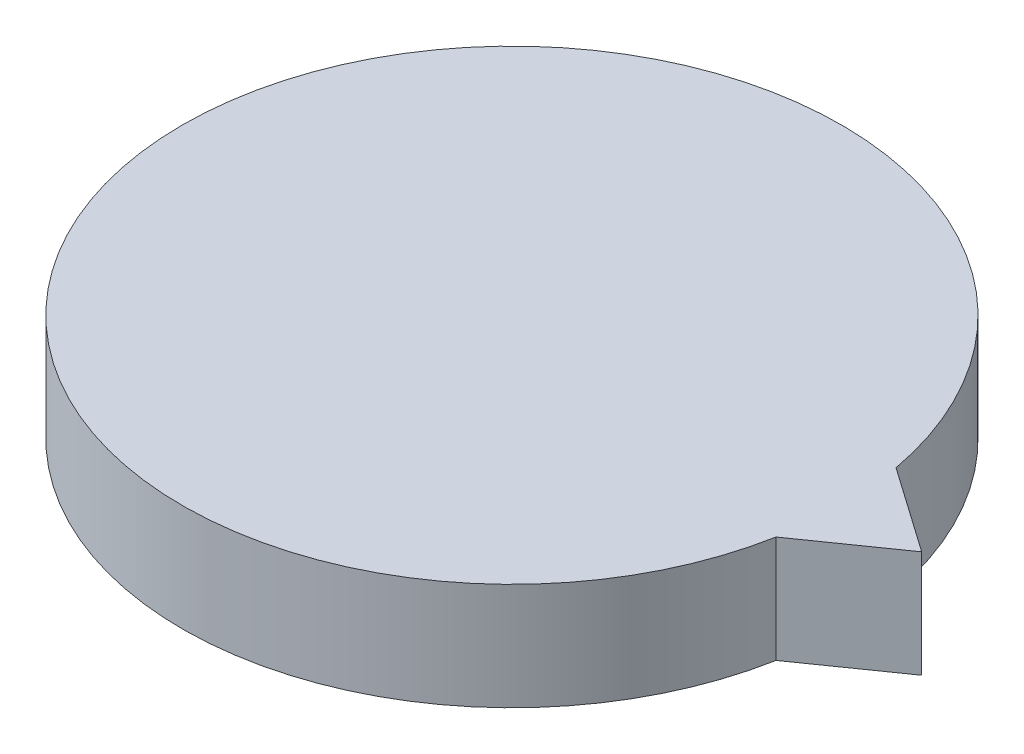
ISO-10303-21;
HEADER;
FILE_DESCRIPTION(('STEP AP214'),'2;1');
FILE_NAME('part.step','',(''),(''),'','','');
FILE_SCHEMA(('AUTOMOTIVE_DESIGN { 1 0 10303 214 1 1 1 1 }'));
ENDSEC;
DATA;
#1=APPLICATION_CONTEXT('core data for automotive mechanical design processes');
#2=APPLICATION_PROTOCOL_DEFINITION('international standard','automotive_design',2000,#1);
#3=PRODUCT_CONTEXT('',#1,'mechanical');
#4=PRODUCT('Part','Part','',(#3));
#5=PRODUCT_RELATED_PRODUCT_CATEGORY('part','',(#4));
#6=PRODUCT_DEFINITION_FORMATION('','',#4);
#7=PRODUCT_DEFINITION_CONTEXT('part definition',#1,'design');
#8=PRODUCT_DEFINITION('design','',#6,#7);
#9=PRODUCT_DEFINITION_SHAPE('','',#8);
#10=(LENGTH_UNIT() NAMED_UNIT(*) SI_UNIT(.MILLI.,.METRE.));
#11=(NAMED_UNIT(*) PLANE_ANGLE_UNIT() SI_UNIT($,.RADIAN.));
#12=(NAMED_UNIT(*) SI_UNIT($,.STERADIAN.) SOLID_ANGLE_UNIT());
#13=UNCERTAINTY_MEASURE_WITH_UNIT(LENGTH_MEASURE(1.E-05),#10,'distance_accuracy_value','');
#14=(GEOMETRIC_REPRESENTATION_CONTEXT(3) GLOBAL_UNCERTAINTY_ASSIGNED_CONTEXT((#13)) GLOBAL_UNIT_ASSIGNED_CONTEXT((#10,
#11,#12)) REPRESENTATION_CONTEXT('',''));
#15=CARTESIAN_POINT('',(0.,0.,0.));
#16=DIRECTION('',(0.,0.,1.));
#17=DIRECTION('',(1.,0.,0.));
#18=AXIS2_PLACEMENT_3D('',#15,#16,#17);
#19=CARTESIAN_POINT('',(0.,-2.,0.));
#20=DIRECTION('',(0.,1.,0.));
#21=DIRECTION('',(0.,0.,1.));
#22=AXIS2_PLACEMENT_3D('',#19,#20,#21);
#23=CYLINDRICAL_SURFACE('',#22,5.9);
#24=CARTESIAN_POINT('',(0.,-2.,0.));
#25=DIRECTION('',(0.,1.,0.));
#26=DIRECTION('',(0.,0.,1.));
#27=AXIS2_PLACEMENT_3D('',#24,#25,#26);
#28=CIRCLE('',#27,5.9);
#29=CARTESIAN_POINT('',(-0.915565822058083,-2.,5.82852804964333));
#30=VERTEX_POINT('',#29);
#31=CARTESIAN_POINT('',(4.58987044663219,-2.,3.70716728556082));
#32=VERTEX_POINT('',#31);
#33=EDGE_CURVE('E289',#30,#32,#28,.T.);
#34=ORIENTED_EDGE('',*,*,#33,.T.);
#35=DIRECTION('',(0.,1.,0.));
#36=VECTOR('',#35,1.);
#37=CARTESIAN_POINT('',(4.58987044663221,-2.,3.7071672855608));
#38=LINE('',#37,#36);
#39=CARTESIAN_POINT('',(4.58987044663221,0.,3.7071672855608));
#40=VERTEX_POINT('',#39);
#41=EDGE_CURVE('E279',#32,#40,#38,.T.);
#42=ORIENTED_EDGE('',*,*,#41,.T.);
#43=CARTESIAN_POINT('',(0.,0.,0.));
#44=DIRECTION('',(0.,1.,0.));
#45=DIRECTION('',(0.,0.,1.));
#46=AXIS2_PLACEMENT_3D('',#43,#44,#45);
#47=CIRCLE('',#46,5.9);
#48=CARTESIAN_POINT('',(-0.915565822058086,0.,5.82852804964333));
#49=VERTEX_POINT('',#48);
#50=EDGE_CURVE('E43',#49,#40,#47,.T.);
#51=ORIENTED_EDGE('',*,*,#50,.F.);
#52=DIRECTION('',(0.,1.,0.));
#53=VECTOR('',#52,1.);
#54=CARTESIAN_POINT('',(-0.915565822058086,-2.,5.82852804964333));
#55=LINE('',#54,#53);
#56=EDGE_CURVE('E259',#49,#30,#55,.F.);
#57=ORIENTED_EDGE('',*,*,#56,.T.);
#58=EDGE_LOOP('',(#34,#42,#51,#57));
#59=FACE_BOUND('',#58,.T.);
#60=ADVANCED_FACE('F39',(#59),#23,.T.);
#61=CARTESIAN_POINT('',(5.50543626869035,0.,-2.12136076408253));
#62=VERTEX_POINT('',#61);
#63=CARTESIAN_POINT('',(0.915565822058127,0.,-5.82852804964333));
#64=VERTEX_POINT('',#63);
#65=EDGE_CURVE('E306',#62,#64,#47,.T.);
#66=ORIENTED_EDGE('',*,*,#65,.F.);
#67=DIRECTION('',(0.,1.,0.));
#68=VECTOR('',#67,1.);
#69=CARTESIAN_POINT('',(5.50543626869036,-2.,-2.12136076408253));
#70=LINE('',#69,#68);
#71=CARTESIAN_POINT('',(5.50543626869036,-2.,-2.12136076408252));
#72=VERTEX_POINT('',#71);
#73=EDGE_CURVE('E269',#62,#72,#70,.F.);
#74=ORIENTED_EDGE('',*,*,#73,.T.);
#75=CARTESIAN_POINT('',(0.915565822058131,-2.,-5.82852804964333));
#76=VERTEX_POINT('',#75);
#77=EDGE_CURVE('E293',#72,#76,#28,.T.);
#78=ORIENTED_EDGE('',*,*,#77,.T.);
#79=DIRECTION('',(0.,1.,0.));
#80=VECTOR('',#79,1.);
#81=CARTESIAN_POINT('',(0.915565822058127,-2.,-5.82852804964333));
#82=LINE('',#81,#80);
#83=EDGE_CURVE('E242',#76,#64,#82,.T.);
#84=ORIENTED_EDGE('',*,*,#83,.T.);
#85=EDGE_LOOP('',(#66,#74,#78,#84));
#86=FACE_BOUND('',#85,.T.);
#87=ADVANCED_FACE('F332',(#86),#23,.T.);
#88=CARTESIAN_POINT('',(-4.58987044663225,-2.,-3.70716728556075));
#89=VERTEX_POINT('',#88);
#90=CARTESIAN_POINT('',(-5.50543626869034,-2.,2.12136076408257));
#91=VERTEX_POINT('',#90);
#92=EDGE_CURVE('E292',#89,#91,#28,.T.);
#93=ORIENTED_EDGE('',*,*,#92,.T.);
#94=DIRECTION('',(0.,1.,0.));
#95=VECTOR('',#94,1.);
#96=CARTESIAN_POINT('',(-5.50543626869034,-2.,2.12136076408257));
#97=LINE('',#96,#95);
#98=CARTESIAN_POINT('',(-5.50543626869034,0.,2.12136076408257));
#99=VERTEX_POINT('',#98);
#100=EDGE_CURVE('E65',#91,#99,#97,.T.);
#101=ORIENTED_EDGE('',*,*,#100,.T.);
#102=CARTESIAN_POINT('',(-4.58987044663225,0.,-3.70716728556075));
#103=VERTEX_POINT('',#102);
#104=EDGE_CURVE('E207',#103,#99,#47,.T.);
#105=ORIENTED_EDGE('',*,*,#104,.F.);
#106=DIRECTION('',(0.,1.,0.));
#107=VECTOR('',#106,1.);
#108=CARTESIAN_POINT('',(-4.58987044663225,-2.,-3.70716728556075));
#109=LINE('',#108,#107);
#110=EDGE_CURVE('E232',#103,#89,#109,.F.);
#111=ORIENTED_EDGE('',*,*,#110,.T.);
#112=EDGE_LOOP('',(#93,#101,#105,#111));
#113=FACE_BOUND('',#112,.T.);
#114=ADVANCED_FACE('F333',(#113),#23,.T.);
#115=CARTESIAN_POINT('',(0.,-2.,0.));
#116=DIRECTION('',(0.,1.,0.));
#117=DIRECTION('',(0.,0.,1.));
#118=AXIS2_PLACEMENT_3D('',#115,#116,#117);
#119=CYLINDRICAL_SURFACE('',#118,3.25);
#120=DIRECTION('',(0.,1.,0.));
#121=VECTOR('',#120,1.);
#122=CARTESIAN_POINT('',(2.5283184663652,-2.,2.04208367424959));
#123=LINE('',#122,#121);
#124=CARTESIAN_POINT('',(2.52831846636519,-2.,2.0420836742496));
#125=VERTEX_POINT('',#124);
#126=CARTESIAN_POINT('',(2.52831846636521,0.,2.04208367424959));
#127=VERTEX_POINT('',#126);
#128=EDGE_CURVE('E276',#125,#127,#123,.T.);
#129=ORIENTED_EDGE('',*,*,#128,.F.);
#130=CARTESIAN_POINT('',(0.,-2.,0.));
#131=DIRECTION('',(0.,1.,0.));
#132=DIRECTION('',(0.,0.,1.));
#133=AXIS2_PLACEMENT_3D('',#130,#131,#132);
#134=CIRCLE('',#133,3.25);
#135=CARTESIAN_POINT('',(-0.504337105370978,-2.,3.21062985785438));
#136=VERTEX_POINT('',#135);
#137=EDGE_CURVE('E283',#136,#125,#134,.T.);
#138=ORIENTED_EDGE('',*,*,#137,.F.);
#139=DIRECTION('',(0.,1.,0.));
#140=VECTOR('',#139,1.);
#141=CARTESIAN_POINT('',(-0.504337105370981,-2.,3.21062985785438));
#142=LINE('',#141,#140);
#143=CARTESIAN_POINT('',(-0.504337105370981,0.,3.21062985785438));
#144=VERTEX_POINT('',#143);
#145=EDGE_CURVE('E256',#144,#136,#142,.F.);
#146=ORIENTED_EDGE('',*,*,#145,.F.);
#147=CARTESIAN_POINT('',(0.,0.,0.));
#148=DIRECTION('',(0.,1.,0.));
#149=DIRECTION('',(0.,0.,1.));
#150=AXIS2_PLACEMENT_3D('',#147,#148,#149);
#151=CIRCLE('',#150,3.25);
#152=EDGE_CURVE('E50',#144,#127,#151,.T.);
#153=ORIENTED_EDGE('',*,*,#152,.T.);
#154=EDGE_LOOP('',(#129,#138,#146,#153));
#155=FACE_BOUND('',#154,.T.);
#156=ADVANCED_FACE('F339',(#155),#119,.F.);
#157=DIRECTION('',(0.,1.,0.));
#158=VECTOR('',#157,1.);
#159=CARTESIAN_POINT('',(3.03265557173621,-2.,-1.16854618360479));
#160=LINE('',#159,#158);
#161=CARTESIAN_POINT('',(3.03265557173621,0.,-1.16854618360479));
#162=VERTEX_POINT('',#161);
#163=CARTESIAN_POINT('',(3.03265557173622,-2.,-1.16854618360478));
#164=VERTEX_POINT('',#163);
#165=EDGE_CURVE('E266',#162,#164,#160,.F.);
#166=ORIENTED_EDGE('',*,*,#165,.F.);
#167=CARTESIAN_POINT('',(0.504337105371001,0.,-3.21062985785438));
#168=VERTEX_POINT('',#167);
#169=EDGE_CURVE('E11',#162,#168,#151,.T.);
#170=ORIENTED_EDGE('',*,*,#169,.T.);
#171=DIRECTION('',(0.,1.,0.));
#172=VECTOR('',#171,1.);
#173=CARTESIAN_POINT('',(0.504337105371,-2.,-3.21062985785437));
#174=LINE('',#173,#172);
#175=CARTESIAN_POINT('',(0.504337105371005,-2.,-3.21062985785437));
#176=VERTEX_POINT('',#175);
#177=EDGE_CURVE('E239',#176,#168,#174,.T.);
#178=ORIENTED_EDGE('',*,*,#177,.F.);
#179=EDGE_CURVE('E288',#164,#176,#134,.T.);
#180=ORIENTED_EDGE('',*,*,#179,.F.);
#181=EDGE_LOOP('',(#166,#170,#178,#180));
#182=FACE_BOUND('',#181,.T.);
#183=ADVANCED_FACE('F344',(#182),#119,.F.);
#184=DIRECTION('',(0.,1.,0.));
#185=VECTOR('',#184,1.);
#186=CARTESIAN_POINT('',(-3.03265557173621,-2.,1.1685461836048));
#187=LINE('',#186,#185);
#188=CARTESIAN_POINT('',(-3.03265557173621,-2.,1.1685461836048));
#189=VERTEX_POINT('',#188);
#190=CARTESIAN_POINT('',(-3.03265557173621,0.,1.1685461836048));
#191=VERTEX_POINT('',#190);
#192=EDGE_CURVE('E195',#189,#191,#187,.T.);
#193=ORIENTED_EDGE('',*,*,#192,.F.);
#194=CARTESIAN_POINT('',(-2.52831846636522,-2.,-2.04208367424957));
#195=VERTEX_POINT('',#194);
#196=EDGE_CURVE('E287',#195,#189,#134,.T.);
#197=ORIENTED_EDGE('',*,*,#196,.F.);
#198=DIRECTION('',(0.,1.,0.));
#199=VECTOR('',#198,1.);
#200=CARTESIAN_POINT('',(-2.52831846636522,-2.,-2.04208367424957));
#201=LINE('',#200,#199);
#202=CARTESIAN_POINT('',(-2.52831846636522,0.,-2.04208367424957));
#203=VERTEX_POINT('',#202);
#204=EDGE_CURVE('E197',#203,#195,#201,.F.);
#205=ORIENTED_EDGE('',*,*,#204,.F.);
#206=EDGE_CURVE('E49',#203,#191,#151,.T.);
#207=ORIENTED_EDGE('',*,*,#206,.T.);
#208=EDGE_LOOP('',(#193,#197,#205,#207));
#209=FACE_BOUND('',#208,.T.);
#210=ADVANCED_FACE('F193',(#209),#119,.F.);
#211=CARTESIAN_POINT('',(0.,-2.,0.));
#212=DIRECTION('',(0.,1.,0.));
#213=DIRECTION('',(0.,0.,1.));
#214=AXIS2_PLACEMENT_3D('',#211,#212,#213);
#215=PLANE('',#214);
#216=DIRECTION('',(-0.777944143496982,0.,-0.628333438230648));
#217=VECTOR('',#216,1.);
#218=CARTESIAN_POINT('',(0.,-2.,0.));
#219=LINE('',#218,#217);
#220=EDGE_CURVE('E273',#32,#125,#219,.T.);
#221=ORIENTED_EDGE('',*,*,#220,.F.);
#222=ORIENTED_EDGE('',*,*,#33,.F.);
#223=DIRECTION('',(-0.155180647806455,0.,0.987886110109039));
#224=VECTOR('',#223,1.);
#225=CARTESIAN_POINT('',(0.,-2.,0.));
#226=LINE('',#225,#224);
#227=EDGE_CURVE('E253',#136,#30,#226,.T.);
#228=ORIENTED_EDGE('',*,*,#227,.F.);
#229=ORIENTED_EDGE('',*,*,#137,.T.);
#230=EDGE_LOOP('',(#221,#222,#228,#229));
#231=FACE_BOUND('',#230,.T.);
#232=ADVANCED_FACE('F372',(#231),#215,.F.);
#233=DIRECTION('',(0.933124791303451,0.,-0.359552671878392));
#234=VECTOR('',#233,1.);
#235=CARTESIAN_POINT('',(0.,-2.,0.));
#236=LINE('',#235,#234);
#237=EDGE_CURVE('E263',#164,#72,#236,.T.);
#238=ORIENTED_EDGE('',*,*,#237,.F.);
#239=ORIENTED_EDGE('',*,*,#179,.T.);
#240=DIRECTION('',(-0.155180647806463,0.,0.987886110109038));
#241=VECTOR('',#240,1.);
#242=CARTESIAN_POINT('',(0.,-2.,0.));
#243=LINE('',#242,#241);
#244=EDGE_CURVE('E236',#76,#176,#243,.T.);
#245=ORIENTED_EDGE('',*,*,#244,.F.);
#246=ORIENTED_EDGE('',*,*,#77,.F.);
#247=EDGE_LOOP('',(#238,#239,#245,#246));
#248=FACE_BOUND('',#247,.T.);
#249=ADVANCED_FACE('F374',(#248),#215,.F.);
#250=DIRECTION('',(0.933124791303448,0.,-0.359552671878401));
#251=VECTOR('',#250,1.);
#252=CARTESIAN_POINT('',(0.,-2.,0.));
#253=LINE('',#252,#251);
#254=EDGE_CURVE('E246',#91,#189,#253,.T.);
#255=ORIENTED_EDGE('',*,*,#254,.F.);
#256=ORIENTED_EDGE('',*,*,#92,.F.);
#257=DIRECTION('',(-0.777944143496992,0.,-0.628333438230636));
#258=VECTOR('',#257,1.);
#259=CARTESIAN_POINT('',(0.,-2.,0.));
#260=LINE('',#259,#258);
#261=EDGE_CURVE('E227',#195,#89,#260,.T.);
#262=ORIENTED_EDGE('',*,*,#261,.F.);
#263=ORIENTED_EDGE('',*,*,#196,.T.);
#264=EDGE_LOOP('',(#255,#256,#262,#263));
#265=FACE_BOUND('',#264,.T.);
#266=ADVANCED_FACE('F349',(#265),#215,.F.);
#267=CARTESIAN_POINT('',(0.,3.,0.));
#268=DIRECTION('',(0.,-1.,0.));
#269=DIRECTION('',(0.,0.,-1.));
#270=AXIS2_PLACEMENT_3D('',#267,#268,#269);
#271=CYLINDRICAL_SURFACE('',#270,18.5);
#272=CARTESIAN_POINT('',(0.,-3.,0.));
#273=DIRECTION('',(0.,-1.,0.));
#274=DIRECTION('',(0.,0.,-1.));
#275=AXIS2_PLACEMENT_3D('',#272,#273,#274);
#276=CIRCLE('',#275,18.5);
#277=CARTESIAN_POINT('',(18.1909628259426,-3.,3.36732408080566));
#278=VERTEX_POINT('',#277);
#279=CARTESIAN_POINT('',(18.1909628259426,-3.,-3.36732408080571));
#280=VERTEX_POINT('',#279);
#281=EDGE_CURVE('E154',#278,#280,#276,.T.);
#282=ORIENTED_EDGE('',*,*,#281,.F.);
#283=DIRECTION('',(0.,1.,0.));
#284=VECTOR('',#283,1.);
#285=CARTESIAN_POINT('',(18.1909628259426,-11.2754047878132,3.36732408080566));
#286=LINE('',#285,#284);
#287=CARTESIAN_POINT('',(18.1909628259426,3.,3.36732408080566));
#288=VERTEX_POINT('',#287);
#289=EDGE_CURVE('E158',#278,#288,#286,.T.);
#290=ORIENTED_EDGE('',*,*,#289,.T.);
#291=CARTESIAN_POINT('',(0.,3.,0.));
#292=DIRECTION('',(0.,1.,0.));
#293=DIRECTION('',(0.,0.,1.));
#294=AXIS2_PLACEMENT_3D('',#291,#292,#293);
#295=CIRCLE('',#294,18.5);
#296=CARTESIAN_POINT('',(18.1909628259426,3.,-3.36732408080571));
#297=VERTEX_POINT('',#296);
#298=EDGE_CURVE('E171',#297,#288,#295,.T.);
#299=ORIENTED_EDGE('',*,*,#298,.F.);
#300=DIRECTION('',(0.,1.,0.));
#301=VECTOR('',#300,1.);
#302=CARTESIAN_POINT('',(18.1909628259426,-11.2754047878132,-3.36732408080571));
#303=LINE('',#302,#301);
#304=EDGE_CURVE('E169',#280,#297,#303,.T.);
#305=ORIENTED_EDGE('',*,*,#304,.F.);
#306=EDGE_LOOP('',(#282,#290,#299,#305));
#307=FACE_BOUND('',#306,.T.);
#308=ADVANCED_FACE('F41',(#307),#271,.T.);
#309=CARTESIAN_POINT('',(0.,3.,0.));
#310=DIRECTION('',(0.,1.,0.));
#311=DIRECTION('',(0.,0.,1.));
#312=AXIS2_PLACEMENT_3D('',#309,#310,#311);
#313=PLANE('',#312);
#314=ORIENTED_EDGE('',*,*,#298,.T.);
#315=DIRECTION('',(0.819152044288995,0.,-0.573576436351041));
#316=VECTOR('',#315,1.);
#317=CARTESIAN_POINT('',(23.,3.,0.));
#318=LINE('',#317,#316);
#319=CARTESIAN_POINT('',(23.,3.,0.));
#320=VERTEX_POINT('',#319);
#321=EDGE_CURVE('E163',#288,#320,#318,.T.);
#322=ORIENTED_EDGE('',*,*,#321,.T.);
#323=DIRECTION('',(-0.819152044288992,0.,-0.573576436351047));
#324=VECTOR('',#323,1.);
#325=CARTESIAN_POINT('',(18.1909628259426,3.,-3.36732408080571));
#326=LINE('',#325,#324);
#327=EDGE_CURVE('E395',#320,#297,#326,.T.);
#328=ORIENTED_EDGE('',*,*,#327,.T.);
#329=EDGE_LOOP('',(#314,#322,#328));
#330=FACE_BOUND('',#329,.T.);
#331=ADVANCED_FACE('F328',(#330),#313,.T.);
#332=CARTESIAN_POINT('',(0.,-3.,0.));
#333=DIRECTION('',(0.,-1.,0.));
#334=DIRECTION('',(0.,0.,-1.));
#335=AXIS2_PLACEMENT_3D('',#332,#333,#334);
#336=PLANE('',#335);
#337=ORIENTED_EDGE('',*,*,#281,.T.);
#338=DIRECTION('',(-0.819152044288992,0.,-0.573576436351047));
#339=VECTOR('',#338,1.);
#340=CARTESIAN_POINT('',(18.1909628259426,-3.,-3.36732408080571));
#341=LINE('',#340,#339);
#342=CARTESIAN_POINT('',(23.,-3.,0.));
#343=VERTEX_POINT('',#342);
#344=EDGE_CURVE('E57',#343,#280,#341,.T.);
#345=ORIENTED_EDGE('',*,*,#344,.F.);
#346=DIRECTION('',(0.819152044288995,0.,-0.573576436351041));
#347=VECTOR('',#346,1.);
#348=CARTESIAN_POINT('',(23.,-3.,0.));
#349=LINE('',#348,#347);
#350=EDGE_CURVE('E149',#278,#343,#349,.T.);
#351=ORIENTED_EDGE('',*,*,#350,.F.);
#352=EDGE_LOOP('',(#337,#345,#351));
#353=FACE_BOUND('',#352,.T.);
#354=CARTESIAN_POINT('',(0.,-3.,0.));
#355=DIRECTION('',(0.,-1.,0.));
#356=DIRECTION('',(0.,0.,-1.));
#357=AXIS2_PLACEMENT_3D('',#354,#355,#356);
#358=CIRCLE('',#357,16.5);
#359=CARTESIAN_POINT('',(0.,-3.,-16.5));
#360=VERTEX_POINT('',#359);
#361=EDGE_CURVE('E172',#360,#360,#358,.T.);
#362=ORIENTED_EDGE('',*,*,#361,.F.);
#363=EDGE_LOOP('',(#362));
#364=FACE_BOUND('',#363,.T.);
#365=ADVANCED_FACE('F151',(#353,#364),#336,.T.);
#366=CARTESIAN_POINT('',(0.,-3.,0.));
#367=DIRECTION('',(0.,1.,0.));
#368=DIRECTION('',(0.,0.,1.));
#369=AXIS2_PLACEMENT_3D('',#366,#367,#368);
#370=CYLINDRICAL_SURFACE('',#369,16.5);
#371=ORIENTED_EDGE('',*,*,#361,.T.);
#372=EDGE_LOOP('',(#371));
#373=FACE_BOUND('',#372,.T.);
#374=CARTESIAN_POINT('',(0.,0.,0.));
#375=DIRECTION('',(0.,-1.,0.));
#376=DIRECTION('',(0.,0.,-1.));
#377=AXIS2_PLACEMENT_3D('',#374,#375,#376);
#378=CIRCLE('',#377,16.5);
#379=CARTESIAN_POINT('',(0.,0.,-16.5));
#380=VERTEX_POINT('',#379);
#381=EDGE_CURVE('E178',#380,#380,#378,.T.);
#382=ORIENTED_EDGE('',*,*,#381,.F.);
#383=EDGE_LOOP('',(#382));
#384=FACE_BOUND('',#383,.T.);
#385=ADVANCED_FACE('F319',(#373,#384),#370,.F.);
#386=CARTESIAN_POINT('',(0.,0.,0.));
#387=DIRECTION('',(0.,1.,0.));
#388=DIRECTION('',(0.,0.,1.));
#389=AXIS2_PLACEMENT_3D('',#386,#387,#388);
#390=PLANE('',#389);
#391=ORIENTED_EDGE('',*,*,#50,.T.);
#392=DIRECTION('',(-0.777944143496982,0.,-0.628333438230647));
#393=VECTOR('',#392,1.);
#394=CARTESIAN_POINT('',(4.59674961974151,0.,3.71272348715713));
#395=LINE('',#394,#393);
#396=EDGE_CURVE('E209',#40,#127,#395,.T.);
#397=ORIENTED_EDGE('',*,*,#396,.T.);
#398=ORIENTED_EDGE('',*,*,#152,.F.);
#399=DIRECTION('',(-0.155180647806455,0.,0.987886110109039));
#400=VECTOR('',#399,1.);
#401=CARTESIAN_POINT('',(-0.209377738272237,0.,1.33290692060497));
#402=LINE('',#401,#400);
#403=EDGE_CURVE('E210',#144,#49,#402,.T.);
#404=ORIENTED_EDGE('',*,*,#403,.T.);
#405=EDGE_LOOP('',(#391,#397,#398,#404));
#406=FACE_BOUND('',#405,.T.);
#407=ORIENTED_EDGE('',*,*,#104,.T.);
#408=DIRECTION('',(0.933124791303448,0.,-0.359552671878401));
#409=VECTOR('',#408,1.);
#410=CARTESIAN_POINT('',(-5.51368766697596,0.,2.12454020195409));
#411=LINE('',#410,#409);
#412=EDGE_CURVE('E206',#99,#191,#411,.T.);
#413=ORIENTED_EDGE('',*,*,#412,.T.);
#414=ORIENTED_EDGE('',*,*,#206,.F.);
#415=DIRECTION('',(-0.777944143496992,0.,-0.628333438230636));
#416=VECTOR('',#415,1.);
#417=CARTESIAN_POINT('',(-0.766702535991528,0.,-0.619253765924867));
#418=LINE('',#417,#416);
#419=EDGE_CURVE('E204',#203,#103,#418,.T.);
#420=ORIENTED_EDGE('',*,*,#419,.T.);
#421=EDGE_LOOP('',(#407,#413,#414,#420));
#422=FACE_BOUND('',#421,.T.);
#423=ORIENTED_EDGE('',*,*,#65,.T.);
#424=DIRECTION('',(-0.155180647806463,0.,0.987886110109038));
#425=VECTOR('',#424,1.);
#426=CARTESIAN_POINT('',(0.916938047234444,0.,-5.83726368911118));
#427=LINE('',#426,#425);
#428=EDGE_CURVE('E221',#64,#168,#427,.T.);
#429=ORIENTED_EDGE('',*,*,#428,.T.);
#430=ORIENTED_EDGE('',*,*,#169,.F.);
#431=DIRECTION('',(0.933124791303451,0.,-0.359552671878392));
#432=VECTOR('',#431,1.);
#433=CARTESIAN_POINT('',(1.44383263409493,0.,-0.556339180109989));
#434=LINE('',#433,#432);
#435=EDGE_CURVE('E215',#162,#62,#434,.T.);
#436=ORIENTED_EDGE('',*,*,#435,.T.);
#437=EDGE_LOOP('',(#423,#429,#430,#436));
#438=FACE_BOUND('',#437,.T.);
#439=ORIENTED_EDGE('',*,*,#381,.T.);
#440=EDGE_LOOP('',(#439));
#441=FACE_BOUND('',#440,.T.);
#442=ADVANCED_FACE('F202',(#406,#422,#438,#441),#390,.F.);
#443=CARTESIAN_POINT('',(0.916938047234444,-5.,-5.83726368911118));
#444=DIRECTION('',(-0.987886110109038,0.,-0.155180647806463));
#445=DIRECTION('',(-0.155180647806463,0.,0.987886110109038));
#446=AXIS2_PLACEMENT_3D('',#443,#444,#445);
#447=PLANE('',#446);
#448=ORIENTED_EDGE('',*,*,#244,.T.);
#449=ORIENTED_EDGE('',*,*,#177,.T.);
#450=ORIENTED_EDGE('',*,*,#428,.F.);
#451=ORIENTED_EDGE('',*,*,#83,.F.);
#452=EDGE_LOOP('',(#448,#449,#450,#451));
#453=FACE_BOUND('',#452,.T.);
#454=ADVANCED_FACE('F327',(#453),#447,.T.);
#455=CARTESIAN_POINT('',(-0.766702535991528,-5.,-0.619253765924867));
#456=DIRECTION('',(0.628333438230636,0.,-0.777944143496992));
#457=DIRECTION('',(-0.777944143496992,0.,-0.628333438230636));
#458=AXIS2_PLACEMENT_3D('',#455,#456,#457);
#459=PLANE('',#458);
#460=ORIENTED_EDGE('',*,*,#419,.F.);
#461=ORIENTED_EDGE('',*,*,#204,.T.);
#462=ORIENTED_EDGE('',*,*,#261,.T.);
#463=ORIENTED_EDGE('',*,*,#110,.F.);
#464=EDGE_LOOP('',(#460,#461,#462,#463));
#465=FACE_BOUND('',#464,.T.);
#466=ADVANCED_FACE('F362',(#465),#459,.T.);
#467=CARTESIAN_POINT('',(-0.209377738272237,-5.,1.33290692060497));
#468=DIRECTION('',(-0.987886110109039,0.,-0.155180647806455));
#469=DIRECTION('',(-0.155180647806455,0.,0.987886110109039));
#470=AXIS2_PLACEMENT_3D('',#467,#468,#469);
#471=PLANE('',#470);
#472=ORIENTED_EDGE('',*,*,#403,.F.);
#473=ORIENTED_EDGE('',*,*,#145,.T.);
#474=ORIENTED_EDGE('',*,*,#227,.T.);
#475=ORIENTED_EDGE('',*,*,#56,.F.);
#476=EDGE_LOOP('',(#472,#473,#474,#475));
#477=FACE_BOUND('',#476,.T.);
#478=ADVANCED_FACE('F353',(#477),#471,.T.);
#479=CARTESIAN_POINT('',(-5.51368766697596,-5.,2.12454020195409));
#480=DIRECTION('',(0.359552671878401,0.,0.933124791303448));
#481=DIRECTION('',(0.933124791303448,0.,-0.359552671878401));
#482=AXIS2_PLACEMENT_3D('',#479,#480,#481);
#483=PLANE('',#482);
#484=ORIENTED_EDGE('',*,*,#254,.T.);
#485=ORIENTED_EDGE('',*,*,#192,.T.);
#486=ORIENTED_EDGE('',*,*,#412,.F.);
#487=ORIENTED_EDGE('',*,*,#100,.F.);
#488=EDGE_LOOP('',(#484,#485,#486,#487));
#489=FACE_BOUND('',#488,.T.);
#490=ADVANCED_FACE('F350',(#489),#483,.T.);
#491=CARTESIAN_POINT('',(4.59674961974151,-5.,3.71272348715713));
#492=DIRECTION('',(0.628333438230647,0.,-0.777944143496982));
#493=DIRECTION('',(-0.777944143496982,0.,-0.628333438230648));
#494=AXIS2_PLACEMENT_3D('',#491,#492,#493);
#495=PLANE('',#494);
#496=ORIENTED_EDGE('',*,*,#220,.T.);
#497=ORIENTED_EDGE('',*,*,#128,.T.);
#498=ORIENTED_EDGE('',*,*,#396,.F.);
#499=ORIENTED_EDGE('',*,*,#41,.F.);
#500=EDGE_LOOP('',(#496,#497,#498,#499));
#501=FACE_BOUND('',#500,.T.);
#502=ADVANCED_FACE('F352',(#501),#495,.T.);
#503=CARTESIAN_POINT('',(1.44383263409493,-5.,-0.556339180109989));
#504=DIRECTION('',(0.359552671878392,0.,0.933124791303451));
#505=DIRECTION('',(0.933124791303451,0.,-0.359552671878392));
#506=AXIS2_PLACEMENT_3D('',#503,#504,#505);
#507=PLANE('',#506);
#508=ORIENTED_EDGE('',*,*,#435,.F.);
#509=ORIENTED_EDGE('',*,*,#165,.T.);
#510=ORIENTED_EDGE('',*,*,#237,.T.);
#511=ORIENTED_EDGE('',*,*,#73,.F.);
#512=EDGE_LOOP('',(#508,#509,#510,#511));
#513=FACE_BOUND('',#512,.T.);
#514=ADVANCED_FACE('F359',(#513),#507,.T.);
#515=CARTESIAN_POINT('',(23.,-11.2754047878132,0.));
#516=DIRECTION('',(0.573576436351041,0.,0.819152044288995));
#517=DIRECTION('',(0.819152044288995,0.,-0.573576436351041));
#518=AXIS2_PLACEMENT_3D('',#515,#516,#517);
#519=PLANE('',#518);
#520=ORIENTED_EDGE('',*,*,#289,.F.);
#521=ORIENTED_EDGE('',*,*,#350,.T.);
#522=DIRECTION('',(0.,1.,0.));
#523=VECTOR('',#522,1.);
#524=CARTESIAN_POINT('',(23.,-11.2754047878132,0.));
#525=LINE('',#524,#523);
#526=EDGE_CURVE('E157',#343,#320,#525,.T.);
#527=ORIENTED_EDGE('',*,*,#526,.T.);
#528=ORIENTED_EDGE('',*,*,#321,.F.);
#529=EDGE_LOOP('',(#520,#521,#527,#528));
#530=FACE_BOUND('',#529,.T.);
#531=ADVANCED_FACE('F161',(#530),#519,.T.);
#532=CARTESIAN_POINT('',(18.1909628259426,-11.2754047878132,-3.36732408080571));
#533=DIRECTION('',(0.573576436351046,0.,-0.819152044288991));
#534=DIRECTION('',(-0.819152044288992,0.,-0.573576436351047));
#535=AXIS2_PLACEMENT_3D('',#532,#533,#534);
#536=PLANE('',#535);
#537=ORIENTED_EDGE('',*,*,#526,.F.);
#538=ORIENTED_EDGE('',*,*,#344,.T.);
#539=ORIENTED_EDGE('',*,*,#304,.T.);
#540=ORIENTED_EDGE('',*,*,#327,.F.);
#541=EDGE_LOOP('',(#537,#538,#539,#540));
#542=FACE_BOUND('',#541,.T.);
#543=ADVANCED_FACE('F419',(#542),#536,.T.);
#544=CLOSED_SHELL('',(#60,#87,#114,#156,#183,#210,#232,#249,#266,#308,#331,#365,#385,#442,#454,
#466,#478,#490,#502,#514,#531,#543));
#545=MANIFOLD_SOLID_BREP('B2',#544);
#546=ADVANCED_BREP_SHAPE_REPRESENTATION('',(#18,#545),#14);
#547=SHAPE_DEFINITION_REPRESENTATION(#9,#546);
ENDSEC;
END-ISO-10303-21;
